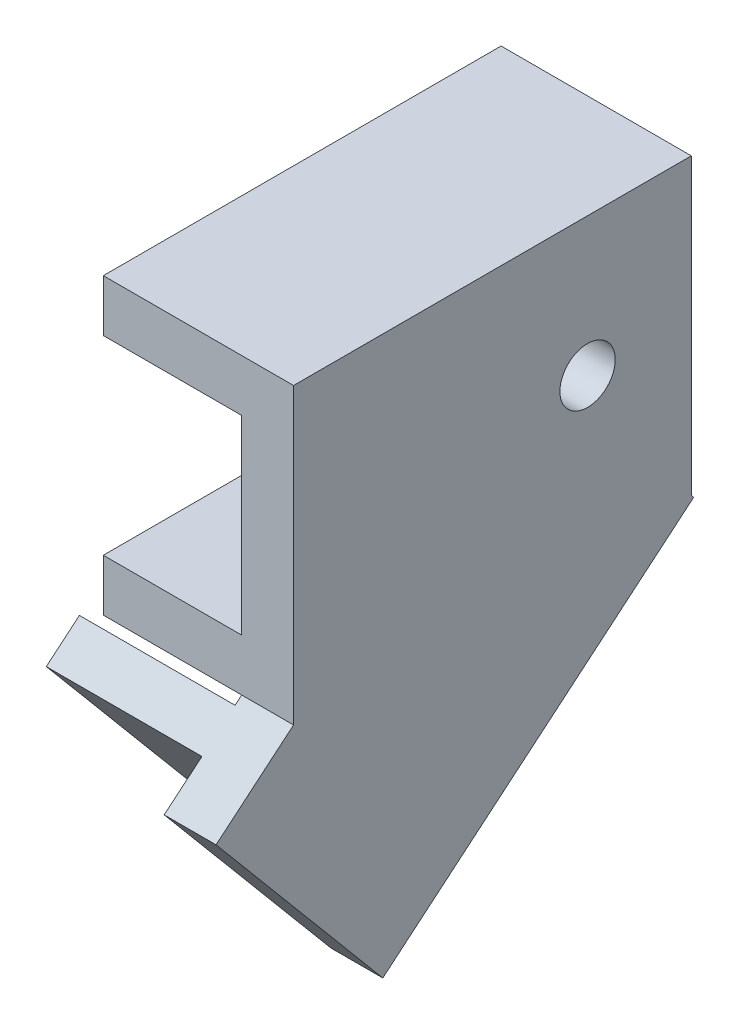
ISO-10303-21;
HEADER;
FILE_DESCRIPTION(('STEP AP214'),'2;1');
FILE_NAME('part.step','',(''),(''),'','','');
FILE_SCHEMA(('AUTOMOTIVE_DESIGN { 1 0 10303 214 1 1 1 1 }'));
ENDSEC;
DATA;
#1=APPLICATION_CONTEXT('core data for automotive mechanical design processes');
#2=APPLICATION_PROTOCOL_DEFINITION('international standard','automotive_design',2000,#1);
#3=PRODUCT_CONTEXT('',#1,'mechanical');
#4=PRODUCT('Part','Part','',(#3));
#5=PRODUCT_RELATED_PRODUCT_CATEGORY('part','',(#4));
#6=PRODUCT_DEFINITION_FORMATION('','',#4);
#7=PRODUCT_DEFINITION_CONTEXT('part definition',#1,'design');
#8=PRODUCT_DEFINITION('design','',#6,#7);
#9=PRODUCT_DEFINITION_SHAPE('','',#8);
#10=(LENGTH_UNIT() NAMED_UNIT(*) SI_UNIT(.MILLI.,.METRE.));
#11=(NAMED_UNIT(*) PLANE_ANGLE_UNIT() SI_UNIT($,.RADIAN.));
#12=(NAMED_UNIT(*) SI_UNIT($,.STERADIAN.) SOLID_ANGLE_UNIT());
#13=UNCERTAINTY_MEASURE_WITH_UNIT(LENGTH_MEASURE(1.E-05),#10,'distance_accuracy_value','');
#14=(GEOMETRIC_REPRESENTATION_CONTEXT(3) GLOBAL_UNCERTAINTY_ASSIGNED_CONTEXT((#13)) GLOBAL_UNIT_ASSIGNED_CONTEXT((#10,
#11,#12)) REPRESENTATION_CONTEXT('',''));
#15=CARTESIAN_POINT('',(0.,0.,0.));
#16=DIRECTION('',(0.,0.,1.));
#17=DIRECTION('',(1.,0.,0.));
#18=AXIS2_PLACEMENT_3D('',#15,#16,#17);
#19=CARTESIAN_POINT('',(-14.,-15.9283628290596,25.2981333293569));
#20=DIRECTION('',(0.,0.642787609686538,-0.76604444311898));
#21=DIRECTION('',(0.,0.76604444311898,0.642787609686538));
#22=AXIS2_PLACEMENT_3D('',#19,#20,#21);
#23=PLANE('',#22);
#24=CARTESIAN_POINT('',(-18.5,-23.9718294818089,18.5488634276483));
#25=DIRECTION('',(0.,-0.642787609686538,0.76604444311898));
#26=DIRECTION('',(0.,0.76604444311898,0.642787609686538));
#27=AXIS2_PLACEMENT_3D('',#24,#25,#26);
#28=CIRCLE('',#27,1.7);
#29=CARTESIAN_POINT('',(-18.5,-22.6695539285066,19.6416023641154));
#30=VERTEX_POINT('',#29);
#31=EDGE_CURVE('E193',#30,#30,#28,.T.);
#32=ORIENTED_EDGE('',*,*,#31,.F.);
#33=EDGE_LOOP('',(#32));
#34=FACE_BOUND('',#33,.T.);
#35=DIRECTION('',(0.,0.766044443118979,0.642787609686538));
#36=VECTOR('',#35,1.);
#37=CARTESIAN_POINT('',(-14.,-15.9283628290596,25.2981333293569));
#38=LINE('',#37,#36);
#39=CARTESIAN_POINT('',(-14.,-27.4190294758443,15.6563191840589));
#40=VERTEX_POINT('',#39);
#41=CARTESIAN_POINT('',(-14.,-15.9283628290596,25.2981333293569));
#42=VERTEX_POINT('',#41);
#43=EDGE_CURVE('E176',#40,#42,#38,.T.);
#44=ORIENTED_EDGE('',*,*,#43,.T.);
#45=DIRECTION('',(1.,0.,0.));
#46=VECTOR('',#45,1.);
#47=CARTESIAN_POINT('',(-14.,-15.9283628290596,25.2981333293569));
#48=LINE('',#47,#46);
#49=CARTESIAN_POINT('',(-23.,-15.9283628290596,25.2981333293569));
#50=VERTEX_POINT('',#49);
#51=EDGE_CURVE('E246',#50,#42,#48,.T.);
#52=ORIENTED_EDGE('',*,*,#51,.F.);
#53=DIRECTION('',(0.,-0.766044443118979,-0.642787609686538));
#54=VECTOR('',#53,1.);
#55=CARTESIAN_POINT('',(-23.,-27.4190294758443,15.6563191840589));
#56=LINE('',#55,#54);
#57=CARTESIAN_POINT('',(-23.,-27.4190294758443,15.6563191840589));
#58=VERTEX_POINT('',#57);
#59=EDGE_CURVE('E197',#50,#58,#56,.T.);
#60=ORIENTED_EDGE('',*,*,#59,.T.);
#61=DIRECTION('',(1.,0.,0.));
#62=VECTOR('',#61,1.);
#63=CARTESIAN_POINT('',(-14.,-27.4190294758443,15.6563191840589));
#64=LINE('',#63,#62);
#65=EDGE_CURVE('E239',#58,#40,#64,.T.);
#66=ORIENTED_EDGE('',*,*,#65,.T.);
#67=EDGE_LOOP('',(#44,#52,#60,#66));
#68=FACE_BOUND('',#67,.T.);
#69=ADVANCED_FACE('F35',(#34,#68),#23,.F.);
#70=CARTESIAN_POINT('',(-14.,0.,0.));
#71=DIRECTION('',(1.,0.,0.));
#72=DIRECTION('',(0.,0.,1.));
#73=AXIS2_PLACEMENT_3D('',#70,#71,#72);
#74=PLANE('',#73);
#75=DIRECTION('',(0.,0.76604444311898,0.642787609686537));
#76=VECTOR('',#75,1.);
#77=CARTESIAN_POINT('',(-14.,-14.3213938048433,23.3830222215595));
#78=LINE('',#77,#76);
#79=CARTESIAN_POINT('',(-14.,-25.812060451628,13.7412080762614));
#80=VERTEX_POINT('',#79);
#81=CARTESIAN_POINT('',(-14.,-14.3213938048433,23.3830222215595));
#82=VERTEX_POINT('',#81);
#83=EDGE_CURVE('E196',#80,#82,#78,.T.);
#84=ORIENTED_EDGE('',*,*,#83,.T.);
#85=DIRECTION('',(0.,-0.642787609686537,0.76604444311898));
#86=VECTOR('',#85,1.);
#87=CARTESIAN_POINT('',(-14.,-14.,23.));
#88=LINE('',#87,#86);
#89=CARTESIAN_POINT('',(-14.,-14.,23.));
#90=VERTEX_POINT('',#89);
#91=EDGE_CURVE('E212',#90,#82,#88,.T.);
#92=ORIENTED_EDGE('',*,*,#91,.F.);
#93=DIRECTION('',(0.,0.,-1.));
#94=VECTOR('',#93,1.);
#95=CARTESIAN_POINT('',(-14.,-14.,23.));
#96=LINE('',#95,#94);
#97=CARTESIAN_POINT('',(-14.,-14.,0.));
#98=VERTEX_POINT('',#97);
#99=EDGE_CURVE('E217',#90,#98,#96,.T.);
#100=ORIENTED_EDGE('',*,*,#99,.T.);
#101=DIRECTION('',(0.,-0.766044443118982,-0.642787609686535));
#102=VECTOR('',#101,1.);
#103=CARTESIAN_POINT('',(-14.,-14.,0.));
#104=LINE('',#103,#102);
#105=CARTESIAN_POINT('',(-14.,-14.1653774871443,-0.13876818846781));
#106=VERTEX_POINT('',#105);
#107=EDGE_CURVE('E213',#98,#106,#104,.T.);
#108=ORIENTED_EDGE('',*,*,#107,.T.);
#109=DIRECTION('',(0.,-0.642787609686538,0.766044443118979));
#110=VECTOR('',#109,1.);
#111=CARTESIAN_POINT('',(-14.,-14.1653774871443,-0.13876818846781));
#112=LINE('',#111,#110);
#113=EDGE_CURVE('E210',#106,#80,#112,.T.);
#114=ORIENTED_EDGE('',*,*,#113,.T.);
#115=EDGE_LOOP('',(#84,#92,#100,#108,#114));
#116=FACE_BOUND('',#115,.T.);
#117=ADVANCED_FACE('F234',(#116),#74,.F.);
#118=CARTESIAN_POINT('',(-22.,0.,23.));
#119=DIRECTION('',(1.,0.,0.));
#120=DIRECTION('',(0.,0.,1.));
#121=AXIS2_PLACEMENT_3D('',#118,#119,#120);
#122=PLANE('',#121);
#123=DIRECTION('',(0.,1.,0.));
#124=VECTOR('',#123,1.);
#125=CARTESIAN_POINT('',(-22.,0.,0.));
#126=LINE('',#125,#124);
#127=CARTESIAN_POINT('',(-22.,0.,0.));
#128=VERTEX_POINT('',#127);
#129=CARTESIAN_POINT('',(-22.,3.,0.));
#130=VERTEX_POINT('',#129);
#131=EDGE_CURVE('E248',#128,#130,#126,.T.);
#132=ORIENTED_EDGE('',*,*,#131,.F.);
#133=DIRECTION('',(0.,0.,-1.));
#134=VECTOR('',#133,1.);
#135=CARTESIAN_POINT('',(-22.,0.,23.));
#136=LINE('',#135,#134);
#137=CARTESIAN_POINT('',(-22.,0.,23.));
#138=VERTEX_POINT('',#137);
#139=EDGE_CURVE('E290',#138,#128,#136,.T.);
#140=ORIENTED_EDGE('',*,*,#139,.F.);
#141=DIRECTION('',(0.,1.,0.));
#142=VECTOR('',#141,1.);
#143=CARTESIAN_POINT('',(-22.,0.,23.));
#144=LINE('',#143,#142);
#145=CARTESIAN_POINT('',(-22.,3.,23.));
#146=VERTEX_POINT('',#145);
#147=EDGE_CURVE('E263',#138,#146,#144,.T.);
#148=ORIENTED_EDGE('',*,*,#147,.T.);
#149=DIRECTION('',(0.,0.,-1.));
#150=VECTOR('',#149,1.);
#151=CARTESIAN_POINT('',(-22.,3.,23.));
#152=LINE('',#151,#150);
#153=EDGE_CURVE('E11',#146,#130,#152,.T.);
#154=ORIENTED_EDGE('',*,*,#153,.T.);
#155=EDGE_LOOP('',(#132,#140,#148,#154));
#156=FACE_BOUND('',#155,.T.);
#157=ADVANCED_FACE('F37',(#156),#122,.F.);
#158=CARTESIAN_POINT('',(-22.,3.,23.));
#159=DIRECTION('',(0.,-1.,0.));
#160=DIRECTION('',(0.,0.,-1.));
#161=AXIS2_PLACEMENT_3D('',#158,#159,#160);
#162=PLANE('',#161);
#163=DIRECTION('',(1.,0.,0.));
#164=VECTOR('',#163,1.);
#165=CARTESIAN_POINT('',(-22.,3.,0.));
#166=LINE('',#165,#164);
#167=CARTESIAN_POINT('',(-11.,3.,0.));
#168=VERTEX_POINT('',#167);
#169=EDGE_CURVE('E310',#130,#168,#166,.T.);
#170=ORIENTED_EDGE('',*,*,#169,.F.);
#171=ORIENTED_EDGE('',*,*,#153,.F.);
#172=DIRECTION('',(1.,0.,0.));
#173=VECTOR('',#172,1.);
#174=CARTESIAN_POINT('',(-22.,3.,23.));
#175=LINE('',#174,#173);
#176=CARTESIAN_POINT('',(-11.,3.,23.));
#177=VERTEX_POINT('',#176);
#178=EDGE_CURVE('E260',#146,#177,#175,.T.);
#179=ORIENTED_EDGE('',*,*,#178,.T.);
#180=DIRECTION('',(0.,0.,-1.));
#181=VECTOR('',#180,1.);
#182=CARTESIAN_POINT('',(-11.,3.,23.));
#183=LINE('',#182,#181);
#184=EDGE_CURVE('E44',#177,#168,#183,.T.);
#185=ORIENTED_EDGE('',*,*,#184,.T.);
#186=EDGE_LOOP('',(#170,#171,#179,#185));
#187=FACE_BOUND('',#186,.T.);
#188=ADVANCED_FACE('F308',(#187),#162,.F.);
#189=CARTESIAN_POINT('',(-11.,3.,23.));
#190=DIRECTION('',(-1.,0.,0.));
#191=DIRECTION('',(0.,0.,-1.));
#192=AXIS2_PLACEMENT_3D('',#189,#190,#191);
#193=PLANE('',#192);
#194=CARTESIAN_POINT('',(-11.,-5.,6.));
#195=DIRECTION('',(-1.,0.,0.));
#196=DIRECTION('',(0.,0.,1.));
#197=AXIS2_PLACEMENT_3D('',#194,#195,#196);
#198=CIRCLE('',#197,1.6);
#199=CARTESIAN_POINT('',(-11.,-5.,7.6));
#200=VERTEX_POINT('',#199);
#201=EDGE_CURVE('E181',#200,#200,#198,.T.);
#202=ORIENTED_EDGE('',*,*,#201,.T.);
#203=EDGE_LOOP('',(#202));
#204=FACE_BOUND('',#203,.T.);
#205=DIRECTION('',(0.,-1.,0.));
#206=VECTOR('',#205,1.);
#207=CARTESIAN_POINT('',(-11.,3.,0.));
#208=LINE('',#207,#206);
#209=CARTESIAN_POINT('',(-11.,-14.,0.));
#210=VERTEX_POINT('',#209);
#211=EDGE_CURVE('E280',#168,#210,#208,.T.);
#212=ORIENTED_EDGE('',*,*,#211,.F.);
#213=ORIENTED_EDGE('',*,*,#184,.F.);
#214=DIRECTION('',(0.,-1.,0.));
#215=VECTOR('',#214,1.);
#216=CARTESIAN_POINT('',(-11.,3.,23.));
#217=LINE('',#216,#215);
#218=CARTESIAN_POINT('',(-11.,-14.,23.));
#219=VERTEX_POINT('',#218);
#220=EDGE_CURVE('E255',#177,#219,#217,.T.);
#221=ORIENTED_EDGE('',*,*,#220,.T.);
#222=DIRECTION('',(0.,-0.642787609686537,0.76604444311898));
#223=VECTOR('',#222,1.);
#224=CARTESIAN_POINT('',(-11.,-14.,23.));
#225=LINE('',#224,#223);
#226=CARTESIAN_POINT('',(-11.,-17.7603075166663,27.481359992246));
#227=VERTEX_POINT('',#226);
#228=EDGE_CURVE('E170',#219,#227,#225,.T.);
#229=ORIENTED_EDGE('',*,*,#228,.T.);
#230=DIRECTION('',(0.,-0.766044443118979,-0.642787609686538));
#231=VECTOR('',#230,1.);
#232=CARTESIAN_POINT('',(-11.,-17.7603075166663,27.481359992246));
#233=LINE('',#232,#231);
#234=CARTESIAN_POINT('',(-11.,-29.2509741634509,17.839545846948));
#235=VERTEX_POINT('',#234);
#236=EDGE_CURVE('E158',#227,#235,#233,.T.);
#237=ORIENTED_EDGE('',*,*,#236,.T.);
#238=DIRECTION('',(0.,-0.642787609686538,0.766044443118979));
#239=VECTOR('',#238,1.);
#240=CARTESIAN_POINT('',(-11.,-14.1653774871443,-0.13876818846781));
#241=LINE('',#240,#239);
#242=CARTESIAN_POINT('',(-11.,-14.1653774871443,-0.13876818846781));
#243=VERTEX_POINT('',#242);
#244=EDGE_CURVE('E164',#243,#235,#241,.T.);
#245=ORIENTED_EDGE('',*,*,#244,.F.);
#246=DIRECTION('',(0.,-0.766044443118982,-0.642787609686535));
#247=VECTOR('',#246,1.);
#248=CARTESIAN_POINT('',(-11.,-14.,0.));
#249=LINE('',#248,#247);
#250=EDGE_CURVE('E171',#210,#243,#249,.T.);
#251=ORIENTED_EDGE('',*,*,#250,.F.);
#252=EDGE_LOOP('',(#212,#213,#221,#229,#237,#245,#251));
#253=FACE_BOUND('',#252,.T.);
#254=ADVANCED_FACE('F173',(#204,#253),#193,.F.);
#255=CARTESIAN_POINT('',(-11.,-14.,23.));
#256=DIRECTION('',(0.,1.,0.));
#257=DIRECTION('',(0.,0.,1.));
#258=AXIS2_PLACEMENT_3D('',#255,#256,#257);
#259=PLANE('',#258);
#260=DIRECTION('',(-1.,0.,0.));
#261=VECTOR('',#260,1.);
#262=CARTESIAN_POINT('',(-11.,-14.,23.));
#263=LINE('',#262,#261);
#264=CARTESIAN_POINT('',(-22.,-14.,23.));
#265=VERTEX_POINT('',#264);
#266=EDGE_CURVE('E259',#90,#265,#263,.T.);
#267=ORIENTED_EDGE('',*,*,#266,.T.);
#268=DIRECTION('',(0.,0.,-1.));
#269=VECTOR('',#268,1.);
#270=CARTESIAN_POINT('',(-22.,-14.,23.));
#271=LINE('',#270,#269);
#272=CARTESIAN_POINT('',(-22.,-14.,0.));
#273=VERTEX_POINT('',#272);
#274=EDGE_CURVE('E303',#265,#273,#271,.T.);
#275=ORIENTED_EDGE('',*,*,#274,.T.);
#276=DIRECTION('',(-1.,0.,0.));
#277=VECTOR('',#276,1.);
#278=CARTESIAN_POINT('',(-11.,-14.,0.));
#279=LINE('',#278,#277);
#280=EDGE_CURVE('E276',#98,#273,#279,.T.);
#281=ORIENTED_EDGE('',*,*,#280,.F.);
#282=ORIENTED_EDGE('',*,*,#99,.F.);
#283=EDGE_LOOP('',(#267,#275,#281,#282));
#284=FACE_BOUND('',#283,.T.);
#285=ADVANCED_FACE('F334',(#284),#259,.F.);
#286=CARTESIAN_POINT('',(-22.,-11.,23.));
#287=DIRECTION('',(-1.,0.,0.));
#288=DIRECTION('',(0.,0.,-1.));
#289=AXIS2_PLACEMENT_3D('',#286,#287,#288);
#290=PLANE('',#289);
#291=DIRECTION('',(0.,-1.,0.));
#292=VECTOR('',#291,1.);
#293=CARTESIAN_POINT('',(-22.,-11.,0.));
#294=LINE('',#293,#292);
#295=CARTESIAN_POINT('',(-22.,-11.,0.));
#296=VERTEX_POINT('',#295);
#297=EDGE_CURVE('E275',#296,#273,#294,.T.);
#298=ORIENTED_EDGE('',*,*,#297,.T.);
#299=ORIENTED_EDGE('',*,*,#274,.F.);
#300=DIRECTION('',(0.,-1.,0.));
#301=VECTOR('',#300,1.);
#302=CARTESIAN_POINT('',(-22.,-11.,23.));
#303=LINE('',#302,#301);
#304=CARTESIAN_POINT('',(-22.,-11.,23.));
#305=VERTEX_POINT('',#304);
#306=EDGE_CURVE('E268',#305,#265,#303,.T.);
#307=ORIENTED_EDGE('',*,*,#306,.F.);
#308=DIRECTION('',(0.,0.,-1.));
#309=VECTOR('',#308,1.);
#310=CARTESIAN_POINT('',(-22.,-11.,23.));
#311=LINE('',#310,#309);
#312=EDGE_CURVE('E300',#305,#296,#311,.T.);
#313=ORIENTED_EDGE('',*,*,#312,.T.);
#314=EDGE_LOOP('',(#298,#299,#307,#313));
#315=FACE_BOUND('',#314,.T.);
#316=ADVANCED_FACE('F329',(#315),#290,.T.);
#317=CARTESIAN_POINT('',(-14.,-11.,23.));
#318=DIRECTION('',(0.,1.,0.));
#319=DIRECTION('',(1.,0.,0.));
#320=AXIS2_PLACEMENT_3D('',#317,#318,#319);
#321=PLANE('',#320);
#322=DIRECTION('',(-1.,0.,0.));
#323=VECTOR('',#322,1.);
#324=CARTESIAN_POINT('',(-14.,-11.,0.));
#325=LINE('',#324,#323);
#326=CARTESIAN_POINT('',(-14.,-11.,0.));
#327=VERTEX_POINT('',#326);
#328=EDGE_CURVE('E284',#327,#296,#325,.T.);
#329=ORIENTED_EDGE('',*,*,#328,.T.);
#330=ORIENTED_EDGE('',*,*,#312,.F.);
#331=DIRECTION('',(-1.,0.,0.));
#332=VECTOR('',#331,1.);
#333=CARTESIAN_POINT('',(-14.,-11.,23.));
#334=LINE('',#333,#332);
#335=CARTESIAN_POINT('',(-14.,-11.,23.));
#336=VERTEX_POINT('',#335);
#337=EDGE_CURVE('E320',#336,#305,#334,.T.);
#338=ORIENTED_EDGE('',*,*,#337,.F.);
#339=DIRECTION('',(0.,0.,-1.));
#340=VECTOR('',#339,1.);
#341=CARTESIAN_POINT('',(-14.,-11.,23.));
#342=LINE('',#341,#340);
#343=EDGE_CURVE('E297',#336,#327,#342,.T.);
#344=ORIENTED_EDGE('',*,*,#343,.T.);
#345=EDGE_LOOP('',(#329,#330,#338,#344));
#346=FACE_BOUND('',#345,.T.);
#347=ADVANCED_FACE('F353',(#346),#321,.T.);
#348=CARTESIAN_POINT('',(-14.,0.,23.));
#349=DIRECTION('',(-1.,0.,0.));
#350=DIRECTION('',(0.,1.,0.));
#351=AXIS2_PLACEMENT_3D('',#348,#349,#350);
#352=PLANE('',#351);
#353=CARTESIAN_POINT('',(-14.,-5.,6.));
#354=DIRECTION('',(1.,0.,0.));
#355=DIRECTION('',(0.,1.,0.));
#356=AXIS2_PLACEMENT_3D('',#353,#354,#355);
#357=CIRCLE('',#356,1.6);
#358=CARTESIAN_POINT('',(-14.,-3.4,6.));
#359=VERTEX_POINT('',#358);
#360=EDGE_CURVE('E39',#359,#359,#357,.T.);
#361=ORIENTED_EDGE('',*,*,#360,.T.);
#362=EDGE_LOOP('',(#361));
#363=FACE_BOUND('',#362,.T.);
#364=DIRECTION('',(0.,-1.,0.));
#365=VECTOR('',#364,1.);
#366=CARTESIAN_POINT('',(-14.,0.,0.));
#367=LINE('',#366,#365);
#368=CARTESIAN_POINT('',(-14.,0.,0.));
#369=VERTEX_POINT('',#368);
#370=EDGE_CURVE('E286',#369,#327,#367,.T.);
#371=ORIENTED_EDGE('',*,*,#370,.T.);
#372=ORIENTED_EDGE('',*,*,#343,.F.);
#373=DIRECTION('',(0.,-1.,0.));
#374=VECTOR('',#373,1.);
#375=CARTESIAN_POINT('',(-14.,0.,23.));
#376=LINE('',#375,#374);
#377=CARTESIAN_POINT('',(-14.,0.,23.));
#378=VERTEX_POINT('',#377);
#379=EDGE_CURVE('E319',#378,#336,#376,.T.);
#380=ORIENTED_EDGE('',*,*,#379,.F.);
#381=DIRECTION('',(0.,0.,-1.));
#382=VECTOR('',#381,1.);
#383=CARTESIAN_POINT('',(-14.,0.,23.));
#384=LINE('',#383,#382);
#385=EDGE_CURVE('E293',#378,#369,#384,.T.);
#386=ORIENTED_EDGE('',*,*,#385,.T.);
#387=EDGE_LOOP('',(#371,#372,#380,#386));
#388=FACE_BOUND('',#387,.T.);
#389=ADVANCED_FACE('F350',(#363,#388),#352,.T.);
#390=CARTESIAN_POINT('',(-22.,0.,23.));
#391=DIRECTION('',(0.,-1.,0.));
#392=DIRECTION('',(0.,0.,-1.));
#393=AXIS2_PLACEMENT_3D('',#390,#391,#392);
#394=PLANE('',#393);
#395=DIRECTION('',(1.,0.,0.));
#396=VECTOR('',#395,1.);
#397=CARTESIAN_POINT('',(-22.,0.,0.));
#398=LINE('',#397,#396);
#399=EDGE_CURVE('E288',#128,#369,#398,.T.);
#400=ORIENTED_EDGE('',*,*,#399,.T.);
#401=ORIENTED_EDGE('',*,*,#385,.F.);
#402=DIRECTION('',(1.,0.,0.));
#403=VECTOR('',#402,1.);
#404=CARTESIAN_POINT('',(-22.,0.,23.));
#405=LINE('',#404,#403);
#406=EDGE_CURVE('E294',#138,#378,#405,.T.);
#407=ORIENTED_EDGE('',*,*,#406,.F.);
#408=ORIENTED_EDGE('',*,*,#139,.T.);
#409=EDGE_LOOP('',(#400,#401,#407,#408));
#410=FACE_BOUND('',#409,.T.);
#411=ADVANCED_FACE('F347',(#410),#394,.T.);
#412=CARTESIAN_POINT('',(-22.,0.,23.));
#413=DIRECTION('',(0.,0.,1.));
#414=DIRECTION('',(-1.,0.,0.));
#415=AXIS2_PLACEMENT_3D('',#412,#413,#414);
#416=PLANE('',#415);
#417=ORIENTED_EDGE('',*,*,#147,.F.);
#418=ORIENTED_EDGE('',*,*,#406,.T.);
#419=ORIENTED_EDGE('',*,*,#379,.T.);
#420=ORIENTED_EDGE('',*,*,#337,.T.);
#421=ORIENTED_EDGE('',*,*,#306,.T.);
#422=ORIENTED_EDGE('',*,*,#266,.F.);
#423=EDGE_CURVE('E221',#219,#90,#263,.T.);
#424=ORIENTED_EDGE('',*,*,#423,.F.);
#425=ORIENTED_EDGE('',*,*,#220,.F.);
#426=ORIENTED_EDGE('',*,*,#178,.F.);
#427=EDGE_LOOP('',(#417,#418,#419,#420,#421,#422,#424,#425,#426));
#428=FACE_BOUND('',#427,.T.);
#429=ADVANCED_FACE('F326',(#428),#416,.T.);
#430=CARTESIAN_POINT('',(-22.,0.,0.));
#431=DIRECTION('',(0.,0.,1.));
#432=DIRECTION('',(-1.,0.,0.));
#433=AXIS2_PLACEMENT_3D('',#430,#431,#432);
#434=PLANE('',#433);
#435=ORIENTED_EDGE('',*,*,#131,.T.);
#436=ORIENTED_EDGE('',*,*,#169,.T.);
#437=ORIENTED_EDGE('',*,*,#211,.T.);
#438=EDGE_CURVE('E272',#210,#98,#279,.T.);
#439=ORIENTED_EDGE('',*,*,#438,.T.);
#440=ORIENTED_EDGE('',*,*,#280,.T.);
#441=ORIENTED_EDGE('',*,*,#297,.F.);
#442=ORIENTED_EDGE('',*,*,#328,.F.);
#443=ORIENTED_EDGE('',*,*,#370,.F.);
#444=ORIENTED_EDGE('',*,*,#399,.F.);
#445=EDGE_LOOP('',(#435,#436,#437,#439,#440,#441,#442,#443,#444));
#446=FACE_BOUND('',#445,.T.);
#447=ADVANCED_FACE('F314',(#446),#434,.F.);
#448=CARTESIAN_POINT('',(-14.,-14.,0.));
#449=DIRECTION('',(0.,0.642787609686535,-0.766044443118981));
#450=DIRECTION('',(0.,0.766044443118982,0.642787609686535));
#451=AXIS2_PLACEMENT_3D('',#448,#449,#450);
#452=PLANE('',#451);
#453=ORIENTED_EDGE('',*,*,#250,.T.);
#454=DIRECTION('',(1.,0.,0.));
#455=VECTOR('',#454,1.);
#456=CARTESIAN_POINT('',(-14.,-14.1653774871443,-0.13876818846781));
#457=LINE('',#456,#455);
#458=EDGE_CURVE('E166',#106,#243,#457,.T.);
#459=ORIENTED_EDGE('',*,*,#458,.F.);
#460=ORIENTED_EDGE('',*,*,#107,.F.);
#461=ORIENTED_EDGE('',*,*,#438,.F.);
#462=EDGE_LOOP('',(#453,#459,#460,#461));
#463=FACE_BOUND('',#462,.T.);
#464=ADVANCED_FACE('F337',(#463),#452,.T.);
#465=CARTESIAN_POINT('',(-14.,-14.,23.));
#466=DIRECTION('',(0.,-0.76604444311898,-0.642787609686537));
#467=DIRECTION('',(0.,0.642787609686537,-0.76604444311898));
#468=AXIS2_PLACEMENT_3D('',#465,#466,#467);
#469=PLANE('',#468);
#470=ORIENTED_EDGE('',*,*,#228,.F.);
#471=ORIENTED_EDGE('',*,*,#423,.T.);
#472=ORIENTED_EDGE('',*,*,#91,.T.);
#473=DIRECTION('',(1.,0.,0.));
#474=VECTOR('',#473,1.);
#475=CARTESIAN_POINT('',(-23.,-14.3213938048433,23.3830222215595));
#476=LINE('',#475,#474);
#477=CARTESIAN_POINT('',(-23.,-14.3213938048433,23.3830222215595));
#478=VERTEX_POINT('',#477);
#479=EDGE_CURVE('E60',#478,#82,#476,.T.);
#480=ORIENTED_EDGE('',*,*,#479,.F.);
#481=DIRECTION('',(0.,-0.642787609686538,0.766044443118979));
#482=VECTOR('',#481,1.);
#483=CARTESIAN_POINT('',(-23.,-15.9283628290596,25.2981333293569));
#484=LINE('',#483,#482);
#485=EDGE_CURVE('E204',#478,#50,#484,.T.);
#486=ORIENTED_EDGE('',*,*,#485,.T.);
#487=ORIENTED_EDGE('',*,*,#51,.T.);
#488=DIRECTION('',(0.,0.642787609686538,-0.766044443118979));
#489=VECTOR('',#488,1.);
#490=CARTESIAN_POINT('',(-14.,-17.7603075166663,27.481359992246));
#491=LINE('',#490,#489);
#492=CARTESIAN_POINT('',(-14.,-17.7603075166663,27.481359992246));
#493=VERTEX_POINT('',#492);
#494=EDGE_CURVE('E185',#493,#42,#491,.T.);
#495=ORIENTED_EDGE('',*,*,#494,.F.);
#496=DIRECTION('',(1.,0.,0.));
#497=VECTOR('',#496,1.);
#498=CARTESIAN_POINT('',(-11.,-17.7603075166663,27.481359992246));
#499=LINE('',#498,#497);
#500=EDGE_CURVE('E184',#493,#227,#499,.T.);
#501=ORIENTED_EDGE('',*,*,#500,.T.);
#502=EDGE_LOOP('',(#470,#471,#472,#480,#486,#487,#495,#501));
#503=FACE_BOUND('',#502,.T.);
#504=ADVANCED_FACE('F231',(#503),#469,.F.);
#505=CARTESIAN_POINT('',(-14.,-14.1653774871443,-0.13876818846781));
#506=DIRECTION('',(0.,-0.766044443118979,-0.642787609686538));
#507=DIRECTION('',(0.,0.642787609686538,-0.766044443118979));
#508=AXIS2_PLACEMENT_3D('',#505,#506,#507);
#509=PLANE('',#508);
#510=ORIENTED_EDGE('',*,*,#244,.T.);
#511=DIRECTION('',(-1.,0.,0.));
#512=VECTOR('',#511,1.);
#513=CARTESIAN_POINT('',(-11.,-29.2509741634509,17.839545846948));
#514=LINE('',#513,#512);
#515=CARTESIAN_POINT('',(-14.,-29.2509741634509,17.839545846948));
#516=VERTEX_POINT('',#515);
#517=EDGE_CURVE('E153',#235,#516,#514,.T.);
#518=ORIENTED_EDGE('',*,*,#517,.T.);
#519=DIRECTION('',(0.,0.642787609686538,-0.766044443118979));
#520=VECTOR('',#519,1.);
#521=CARTESIAN_POINT('',(-14.,-29.2509741634509,17.839545846948));
#522=LINE('',#521,#520);
#523=EDGE_CURVE('E188',#516,#40,#522,.T.);
#524=ORIENTED_EDGE('',*,*,#523,.T.);
#525=ORIENTED_EDGE('',*,*,#65,.F.);
#526=DIRECTION('',(0.,0.642787609686537,-0.76604444311898));
#527=VECTOR('',#526,1.);
#528=CARTESIAN_POINT('',(-23.,-25.812060451628,13.7412080762614));
#529=LINE('',#528,#527);
#530=CARTESIAN_POINT('',(-23.,-25.812060451628,13.7412080762614));
#531=VERTEX_POINT('',#530);
#532=EDGE_CURVE('E200',#58,#531,#529,.T.);
#533=ORIENTED_EDGE('',*,*,#532,.T.);
#534=DIRECTION('',(1.,0.,0.));
#535=VECTOR('',#534,1.);
#536=CARTESIAN_POINT('',(-23.,-25.812060451628,13.7412080762614));
#537=LINE('',#536,#535);
#538=EDGE_CURVE('E52',#531,#80,#537,.T.);
#539=ORIENTED_EDGE('',*,*,#538,.T.);
#540=ORIENTED_EDGE('',*,*,#113,.F.);
#541=ORIENTED_EDGE('',*,*,#458,.T.);
#542=EDGE_LOOP('',(#510,#518,#524,#525,#533,#539,#540,#541));
#543=FACE_BOUND('',#542,.T.);
#544=ADVANCED_FACE('F165',(#543),#509,.T.);
#545=CARTESIAN_POINT('',(-23.,-14.3213938048433,23.3830222215595));
#546=DIRECTION('',(0.,-0.642787609686537,0.76604444311898));
#547=DIRECTION('',(0.,-0.76604444311898,-0.642787609686537));
#548=AXIS2_PLACEMENT_3D('',#545,#546,#547);
#549=PLANE('',#548);
#550=CARTESIAN_POINT('',(-18.5,-22.3648604575926,16.6337523198509));
#551=DIRECTION('',(0.,-0.642787609686538,0.766044443118979));
#552=DIRECTION('',(0.,0.766044443118979,0.642787609686538));
#553=AXIS2_PLACEMENT_3D('',#550,#551,#552);
#554=CIRCLE('',#553,1.7);
#555=CARTESIAN_POINT('',(-18.5,-21.0625849042903,17.726491256318));
#556=VERTEX_POINT('',#555);
#557=EDGE_CURVE('E190',#556,#556,#554,.T.);
#558=ORIENTED_EDGE('',*,*,#557,.T.);
#559=EDGE_LOOP('',(#558));
#560=FACE_BOUND('',#559,.T.);
#561=ORIENTED_EDGE('',*,*,#83,.F.);
#562=ORIENTED_EDGE('',*,*,#538,.F.);
#563=DIRECTION('',(0.,0.76604444311898,0.642787609686537));
#564=VECTOR('',#563,1.);
#565=CARTESIAN_POINT('',(-23.,-14.3213938048433,23.3830222215595));
#566=LINE('',#565,#564);
#567=EDGE_CURVE('E202',#531,#478,#566,.T.);
#568=ORIENTED_EDGE('',*,*,#567,.T.);
#569=ORIENTED_EDGE('',*,*,#479,.T.);
#570=EDGE_LOOP('',(#561,#562,#568,#569));
#571=FACE_BOUND('',#570,.T.);
#572=ADVANCED_FACE('F235',(#560,#571),#549,.F.);
#573=CARTESIAN_POINT('',(-23.,0.,0.));
#574=DIRECTION('',(1.,0.,0.));
#575=DIRECTION('',(0.,0.,1.));
#576=AXIS2_PLACEMENT_3D('',#573,#574,#575);
#577=PLANE('',#576);
#578=ORIENTED_EDGE('',*,*,#59,.F.);
#579=ORIENTED_EDGE('',*,*,#485,.F.);
#580=ORIENTED_EDGE('',*,*,#567,.F.);
#581=ORIENTED_EDGE('',*,*,#532,.F.);
#582=EDGE_LOOP('',(#578,#579,#580,#581));
#583=FACE_BOUND('',#582,.T.);
#584=ADVANCED_FACE('F242',(#583),#577,.F.);
#585=CARTESIAN_POINT('',(-18.5,-28.7194961435051,24.2069122281645));
#586=DIRECTION('',(0.,0.642787609686538,-0.766044443118979));
#587=DIRECTION('',(0.,0.76604444311898,0.642787609686538));
#588=AXIS2_PLACEMENT_3D('',#585,#586,#587);
#589=CYLINDRICAL_SURFACE('',#588,1.7);
#590=ORIENTED_EDGE('',*,*,#557,.F.);
#591=EDGE_LOOP('',(#590));
#592=FACE_BOUND('',#591,.T.);
#593=ORIENTED_EDGE('',*,*,#31,.T.);
#594=EDGE_LOOP('',(#593));
#595=FACE_BOUND('',#594,.T.);
#596=ADVANCED_FACE('F420',(#592,#595),#589,.F.);
#597=CARTESIAN_POINT('',(-14.,-17.7603075166663,27.481359992246));
#598=DIRECTION('',(1.,0.,0.));
#599=DIRECTION('',(0.,-1.,0.));
#600=AXIS2_PLACEMENT_3D('',#597,#598,#599);
#601=PLANE('',#600);
#602=ORIENTED_EDGE('',*,*,#43,.F.);
#603=ORIENTED_EDGE('',*,*,#523,.F.);
#604=DIRECTION('',(0.,0.766044443118979,0.642787609686538));
#605=VECTOR('',#604,1.);
#606=CARTESIAN_POINT('',(-14.,-17.7603075166663,27.481359992246));
#607=LINE('',#606,#605);
#608=EDGE_CURVE('E160',#516,#493,#607,.T.);
#609=ORIENTED_EDGE('',*,*,#608,.T.);
#610=ORIENTED_EDGE('',*,*,#494,.T.);
#611=EDGE_LOOP('',(#602,#603,#609,#610));
#612=FACE_BOUND('',#611,.T.);
#613=ADVANCED_FACE('F252',(#612),#601,.F.);
#614=CARTESIAN_POINT('',(-22.,-20.8700594326381,24.8719683065012));
#615=DIRECTION('',(0.,-0.642787609686538,0.766044443118979));
#616=DIRECTION('',(0.,-0.766044443118979,-0.642787609686538));
#617=AXIS2_PLACEMENT_3D('',#614,#615,#616);
#618=PLANE('',#617);
#619=ORIENTED_EDGE('',*,*,#236,.F.);
#620=ORIENTED_EDGE('',*,*,#500,.F.);
#621=ORIENTED_EDGE('',*,*,#608,.F.);
#622=ORIENTED_EDGE('',*,*,#517,.F.);
#623=EDGE_LOOP('',(#619,#620,#621,#622));
#624=FACE_BOUND('',#623,.T.);
#625=ADVANCED_FACE('F155',(#624),#618,.T.);
#626=CARTESIAN_POINT('',(-23.,-5.,6.));
#627=DIRECTION('',(1.,0.,0.));
#628=DIRECTION('',(0.,0.,1.));
#629=AXIS2_PLACEMENT_3D('',#626,#627,#628);
#630=CYLINDRICAL_SURFACE('',#629,1.6);
#631=ORIENTED_EDGE('',*,*,#360,.F.);
#632=EDGE_LOOP('',(#631));
#633=FACE_BOUND('',#632,.T.);
#634=ORIENTED_EDGE('',*,*,#201,.F.);
#635=EDGE_LOOP('',(#634));
#636=FACE_BOUND('',#635,.T.);
#637=ADVANCED_FACE('F440',(#633,#636),#630,.F.);
#638=CLOSED_SHELL('',(#69,#117,#157,#188,#254,#285,#316,#347,#389,#411,#429,#447,#464,#504,#544,
#572,#584,#596,#613,#625,#637));
#639=MANIFOLD_SOLID_BREP('B2',#638);
#640=ADVANCED_BREP_SHAPE_REPRESENTATION('',(#18,#639),#14);
#641=SHAPE_DEFINITION_REPRESENTATION(#9,#640);
ENDSEC;
END-ISO-10303-21;
